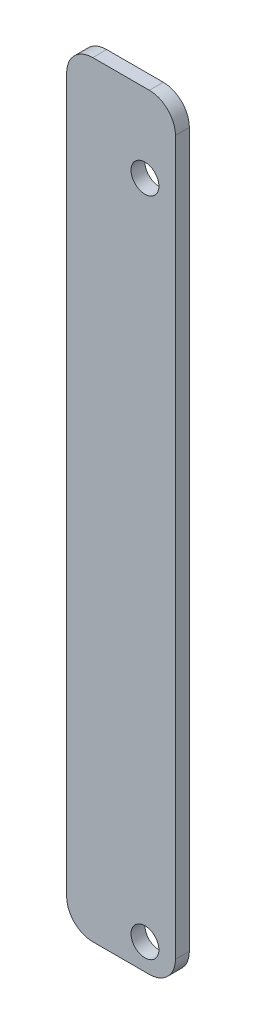
ISO-10303-21;
HEADER;
FILE_DESCRIPTION(('STEP AP214'),'2;1');
FILE_NAME('part.step','',(''),(''),'','','');
FILE_SCHEMA(('AUTOMOTIVE_DESIGN { 1 0 10303 214 1 1 1 1 }'));
ENDSEC;
DATA;
#1=APPLICATION_CONTEXT('core data for automotive mechanical design processes');
#2=APPLICATION_PROTOCOL_DEFINITION('international standard','automotive_design',2000,#1);
#3=PRODUCT_CONTEXT('',#1,'mechanical');
#4=PRODUCT('Part','Part','',(#3));
#5=PRODUCT_RELATED_PRODUCT_CATEGORY('part','',(#4));
#6=PRODUCT_DEFINITION_FORMATION('','',#4);
#7=PRODUCT_DEFINITION_CONTEXT('part definition',#1,'design');
#8=PRODUCT_DEFINITION('design','',#6,#7);
#9=PRODUCT_DEFINITION_SHAPE('','',#8);
#10=(LENGTH_UNIT() NAMED_UNIT(*) SI_UNIT(.MILLI.,.METRE.));
#11=(NAMED_UNIT(*) PLANE_ANGLE_UNIT() SI_UNIT($,.RADIAN.));
#12=(NAMED_UNIT(*) SI_UNIT($,.STERADIAN.) SOLID_ANGLE_UNIT());
#13=UNCERTAINTY_MEASURE_WITH_UNIT(LENGTH_MEASURE(1.E-05),#10,'distance_accuracy_value','');
#14=(GEOMETRIC_REPRESENTATION_CONTEXT(3) GLOBAL_UNCERTAINTY_ASSIGNED_CONTEXT((#13)) GLOBAL_UNIT_ASSIGNED_CONTEXT((#10,
#11,#12)) REPRESENTATION_CONTEXT('',''));
#15=CARTESIAN_POINT('',(0.,0.,0.));
#16=DIRECTION('',(0.,0.,1.));
#17=DIRECTION('',(1.,0.,0.));
#18=AXIS2_PLACEMENT_3D('',#15,#16,#17);
#19=CARTESIAN_POINT('',(-46.8525204271578,-49.9812204173606,98.4383468434213));
#20=DIRECTION('',(0.,0.,-1.));
#21=DIRECTION('',(-1.,0.,0.));
#22=AXIS2_PLACEMENT_3D('',#19,#20,#21);
#23=PLANE('',#22);
#24=CARTESIAN_POINT('',(-50.3525204271578,29.0187795826394,98.4383468434213));
#25=DIRECTION('',(0.,0.,1.));
#26=DIRECTION('',(1.,0.,0.));
#27=AXIS2_PLACEMENT_3D('',#24,#25,#26);
#28=CIRCLE('',#27,1.59999999999999);
#29=CARTESIAN_POINT('',(-48.7525204271578,29.0187795826394,98.4383468434213));
#30=VERTEX_POINT('',#29);
#31=EDGE_CURVE('E185',#30,#30,#28,.T.);
#32=ORIENTED_EDGE('',*,*,#31,.F.);
#33=EDGE_LOOP('',(#32));
#34=FACE_BOUND('',#33,.T.);
#35=DIRECTION('',(0.,1.,0.));
#36=VECTOR('',#35,1.);
#37=CARTESIAN_POINT('',(-46.8525204271578,38.0187795826394,98.4383468434213));
#38=LINE('',#37,#36);
#39=CARTESIAN_POINT('',(-46.8525204271578,-46.9812204173606,98.4383468434213));
#40=VERTEX_POINT('',#39);
#41=CARTESIAN_POINT('',(-46.8525204271578,35.0187795826394,98.4383468434213));
#42=VERTEX_POINT('',#41);
#43=EDGE_CURVE('E134',#40,#42,#38,.T.);
#44=ORIENTED_EDGE('',*,*,#43,.T.);
#45=CARTESIAN_POINT('',(-49.8525204271578,35.0187795826394,98.4383468434213));
#46=DIRECTION('',(0.,0.,-1.));
#47=DIRECTION('',(-1.,0.,0.));
#48=AXIS2_PLACEMENT_3D('',#45,#46,#47);
#49=CIRCLE('',#48,3.);
#50=CARTESIAN_POINT('',(-49.8525204271578,38.0187795826394,98.4383468434213));
#51=VERTEX_POINT('',#50);
#52=EDGE_CURVE('E149',#42,#51,#49,.F.);
#53=ORIENTED_EDGE('',*,*,#52,.T.);
#54=DIRECTION('',(-1.,0.,0.));
#55=VECTOR('',#54,1.);
#56=CARTESIAN_POINT('',(-46.8525204271578,38.0187795826394,98.4383468434213));
#57=LINE('',#56,#55);
#58=CARTESIAN_POINT('',(-56.3525204271578,38.0187795826394,98.4383468434213));
#59=VERTEX_POINT('',#58);
#60=EDGE_CURVE('E117',#51,#59,#57,.T.);
#61=ORIENTED_EDGE('',*,*,#60,.T.);
#62=CARTESIAN_POINT('',(-56.3525204271578,35.0187795826394,98.4383468434213));
#63=DIRECTION('',(0.,0.,-1.));
#64=DIRECTION('',(-1.,0.,0.));
#65=AXIS2_PLACEMENT_3D('',#62,#63,#64);
#66=CIRCLE('',#65,3.);
#67=CARTESIAN_POINT('',(-59.3525204271578,35.0187795826394,98.4383468434213));
#68=VERTEX_POINT('',#67);
#69=EDGE_CURVE('E147',#59,#68,#66,.F.);
#70=ORIENTED_EDGE('',*,*,#69,.T.);
#71=DIRECTION('',(0.,-1.,0.));
#72=VECTOR('',#71,1.);
#73=CARTESIAN_POINT('',(-59.3525204271578,38.0187795826394,98.4383468434213));
#74=LINE('',#73,#72);
#75=CARTESIAN_POINT('',(-59.3525204271578,-46.9812204173606,98.4383468434213));
#76=VERTEX_POINT('',#75);
#77=EDGE_CURVE('E169',#68,#76,#74,.T.);
#78=ORIENTED_EDGE('',*,*,#77,.T.);
#79=CARTESIAN_POINT('',(-56.3525204271578,-46.9812204173606,98.4383468434213));
#80=DIRECTION('',(0.,0.,-1.));
#81=DIRECTION('',(-1.,0.,0.));
#82=AXIS2_PLACEMENT_3D('',#79,#80,#81);
#83=CIRCLE('',#82,3.);
#84=CARTESIAN_POINT('',(-56.3525204271578,-49.9812204173606,98.4383468434213));
#85=VERTEX_POINT('',#84);
#86=EDGE_CURVE('E52',#76,#85,#83,.F.);
#87=ORIENTED_EDGE('',*,*,#86,.T.);
#88=DIRECTION('',(1.,0.,0.));
#89=VECTOR('',#88,1.);
#90=CARTESIAN_POINT('',(-46.8525204271578,-49.9812204173606,98.4383468434213));
#91=LINE('',#90,#89);
#92=CARTESIAN_POINT('',(-49.8525204271578,-49.9812204173606,98.4383468434213));
#93=VERTEX_POINT('',#92);
#94=EDGE_CURVE('E135',#85,#93,#91,.T.);
#95=ORIENTED_EDGE('',*,*,#94,.T.);
#96=CARTESIAN_POINT('',(-49.8525204271578,-46.9812204173606,98.4383468434213));
#97=DIRECTION('',(0.,0.,-1.));
#98=DIRECTION('',(-1.,0.,0.));
#99=AXIS2_PLACEMENT_3D('',#96,#97,#98);
#100=CIRCLE('',#99,3.);
#101=EDGE_CURVE('E145',#93,#40,#100,.F.);
#102=ORIENTED_EDGE('',*,*,#101,.T.);
#103=EDGE_LOOP('',(#44,#53,#61,#70,#78,#87,#95,#102));
#104=FACE_BOUND('',#103,.T.);
#105=CARTESIAN_POINT('',(-50.3525204271578,-46.9812204173606,98.4383468434213));
#106=DIRECTION('',(0.,0.,1.));
#107=DIRECTION('',(1.,0.,0.));
#108=AXIS2_PLACEMENT_3D('',#105,#106,#107);
#109=CIRCLE('',#108,1.59999999999999);
#110=CARTESIAN_POINT('',(-48.7525204271578,-46.9812204173606,98.4383468434213));
#111=VERTEX_POINT('',#110);
#112=EDGE_CURVE('E180',#111,#111,#109,.T.);
#113=ORIENTED_EDGE('',*,*,#112,.F.);
#114=EDGE_LOOP('',(#113));
#115=FACE_BOUND('',#114,.T.);
#116=ADVANCED_FACE('F32',(#34,#104,#115),#23,.F.);
#117=CARTESIAN_POINT('',(-46.8525204271578,38.0187795826394,98.4383468434213));
#118=DIRECTION('',(-1.,0.,0.));
#119=DIRECTION('',(0.,-1.,0.));
#120=AXIS2_PLACEMENT_3D('',#117,#118,#119);
#121=PLANE('',#120);
#122=DIRECTION('',(0.,1.,0.));
#123=VECTOR('',#122,1.);
#124=CARTESIAN_POINT('',(-46.8525204271578,38.0187795826394,96.8383468434213));
#125=LINE('',#124,#123);
#126=CARTESIAN_POINT('',(-46.8525204271578,-46.9812204173606,96.8383468434213));
#127=VERTEX_POINT('',#126);
#128=CARTESIAN_POINT('',(-46.8525204271578,35.0187795826394,96.8383468434213));
#129=VERTEX_POINT('',#128);
#130=EDGE_CURVE('E124',#127,#129,#125,.T.);
#131=ORIENTED_EDGE('',*,*,#130,.T.);
#132=DIRECTION('',(0.,0.,-1.));
#133=VECTOR('',#132,1.);
#134=CARTESIAN_POINT('',(-46.8525204271578,35.0187795826394,98.4383468434213));
#135=LINE('',#134,#133);
#136=EDGE_CURVE('E102',#129,#42,#135,.F.);
#137=ORIENTED_EDGE('',*,*,#136,.T.);
#138=ORIENTED_EDGE('',*,*,#43,.F.);
#139=DIRECTION('',(0.,0.,-1.));
#140=VECTOR('',#139,1.);
#141=CARTESIAN_POINT('',(-46.8525204271578,-46.9812204173606,98.4383468434213));
#142=LINE('',#141,#140);
#143=EDGE_CURVE('E107',#40,#127,#142,.T.);
#144=ORIENTED_EDGE('',*,*,#143,.T.);
#145=EDGE_LOOP('',(#131,#137,#138,#144));
#146=FACE_BOUND('',#145,.T.);
#147=ADVANCED_FACE('F166',(#146),#121,.F.);
#148=CARTESIAN_POINT('',(-46.8525204271578,38.0187795826394,98.4383468434213));
#149=DIRECTION('',(0.,-1.,0.));
#150=DIRECTION('',(0.,0.,-1.));
#151=AXIS2_PLACEMENT_3D('',#148,#149,#150);
#152=PLANE('',#151);
#153=ORIENTED_EDGE('',*,*,#60,.F.);
#154=DIRECTION('',(0.,0.,-1.));
#155=VECTOR('',#154,1.);
#156=CARTESIAN_POINT('',(-49.8525204271578,38.0187795826394,98.4383468434213));
#157=LINE('',#156,#155);
#158=CARTESIAN_POINT('',(-49.8525204271578,38.0187795826394,96.8383468434213));
#159=VERTEX_POINT('',#158);
#160=EDGE_CURVE('E101',#51,#159,#157,.T.);
#161=ORIENTED_EDGE('',*,*,#160,.T.);
#162=DIRECTION('',(-1.,0.,0.));
#163=VECTOR('',#162,1.);
#164=CARTESIAN_POINT('',(-46.8525204271578,38.0187795826394,96.8383468434213));
#165=LINE('',#164,#163);
#166=CARTESIAN_POINT('',(-56.3525204271578,38.0187795826394,96.8383468434213));
#167=VERTEX_POINT('',#166);
#168=EDGE_CURVE('E114',#159,#167,#165,.T.);
#169=ORIENTED_EDGE('',*,*,#168,.T.);
#170=DIRECTION('',(0.,0.,-1.));
#171=VECTOR('',#170,1.);
#172=CARTESIAN_POINT('',(-56.3525204271578,38.0187795826394,98.4383468434213));
#173=LINE('',#172,#171);
#174=EDGE_CURVE('E119',#167,#59,#173,.F.);
#175=ORIENTED_EDGE('',*,*,#174,.T.);
#176=EDGE_LOOP('',(#153,#161,#169,#175));
#177=FACE_BOUND('',#176,.T.);
#178=ADVANCED_FACE('F113',(#177),#152,.F.);
#179=CARTESIAN_POINT('',(-59.3525204271578,38.0187795826394,98.4383468434213));
#180=DIRECTION('',(1.,0.,0.));
#181=DIRECTION('',(0.,1.,0.));
#182=AXIS2_PLACEMENT_3D('',#179,#180,#181);
#183=PLANE('',#182);
#184=ORIENTED_EDGE('',*,*,#77,.F.);
#185=DIRECTION('',(0.,0.,-1.));
#186=VECTOR('',#185,1.);
#187=CARTESIAN_POINT('',(-59.3525204271578,35.0187795826394,98.4383468434213));
#188=LINE('',#187,#186);
#189=CARTESIAN_POINT('',(-59.3525204271578,35.0187795826394,96.8383468434213));
#190=VERTEX_POINT('',#189);
#191=EDGE_CURVE('E153',#68,#190,#188,.T.);
#192=ORIENTED_EDGE('',*,*,#191,.T.);
#193=DIRECTION('',(0.,-1.,0.));
#194=VECTOR('',#193,1.);
#195=CARTESIAN_POINT('',(-59.3525204271578,38.0187795826394,96.8383468434213));
#196=LINE('',#195,#194);
#197=CARTESIAN_POINT('',(-59.3525204271578,-46.9812204173606,96.8383468434213));
#198=VERTEX_POINT('',#197);
#199=EDGE_CURVE('E123',#190,#198,#196,.T.);
#200=ORIENTED_EDGE('',*,*,#199,.T.);
#201=DIRECTION('',(0.,0.,-1.));
#202=VECTOR('',#201,1.);
#203=CARTESIAN_POINT('',(-59.3525204271578,-46.9812204173606,98.4383468434213));
#204=LINE('',#203,#202);
#205=EDGE_CURVE('E151',#198,#76,#204,.F.);
#206=ORIENTED_EDGE('',*,*,#205,.T.);
#207=EDGE_LOOP('',(#184,#192,#200,#206));
#208=FACE_BOUND('',#207,.T.);
#209=ADVANCED_FACE('F211',(#208),#183,.F.);
#210=CARTESIAN_POINT('',(-46.8525204271578,-49.9812204173606,98.4383468434213));
#211=DIRECTION('',(0.,1.,0.));
#212=DIRECTION('',(-1.,0.,0.));
#213=AXIS2_PLACEMENT_3D('',#210,#211,#212);
#214=PLANE('',#213);
#215=DIRECTION('',(1.,0.,0.));
#216=VECTOR('',#215,1.);
#217=CARTESIAN_POINT('',(-46.8525204271578,-49.9812204173606,96.8383468434213));
#218=LINE('',#217,#216);
#219=CARTESIAN_POINT('',(-56.3525204271578,-49.9812204173606,96.8383468434213));
#220=VERTEX_POINT('',#219);
#221=CARTESIAN_POINT('',(-49.8525204271578,-49.9812204173606,96.8383468434213));
#222=VERTEX_POINT('',#221);
#223=EDGE_CURVE('E127',#220,#222,#218,.T.);
#224=ORIENTED_EDGE('',*,*,#223,.T.);
#225=DIRECTION('',(0.,0.,-1.));
#226=VECTOR('',#225,1.);
#227=CARTESIAN_POINT('',(-49.8525204271578,-49.9812204173606,98.4383468434213));
#228=LINE('',#227,#226);
#229=EDGE_CURVE('E11',#222,#93,#228,.F.);
#230=ORIENTED_EDGE('',*,*,#229,.T.);
#231=ORIENTED_EDGE('',*,*,#94,.F.);
#232=DIRECTION('',(0.,0.,-1.));
#233=VECTOR('',#232,1.);
#234=CARTESIAN_POINT('',(-56.3525204271578,-49.9812204173606,98.4383468434213));
#235=LINE('',#234,#233);
#236=EDGE_CURVE('E40',#85,#220,#235,.T.);
#237=ORIENTED_EDGE('',*,*,#236,.T.);
#238=EDGE_LOOP('',(#224,#230,#231,#237));
#239=FACE_BOUND('',#238,.T.);
#240=ADVANCED_FACE('F158',(#239),#214,.F.);
#241=CARTESIAN_POINT('',(-46.8525204271578,-49.9812204173606,96.8383468434213));
#242=DIRECTION('',(0.,0.,-1.));
#243=DIRECTION('',(-1.,0.,0.));
#244=AXIS2_PLACEMENT_3D('',#241,#242,#243);
#245=PLANE('',#244);
#246=CARTESIAN_POINT('',(-50.3525204271578,29.0187795826394,96.8383468434213));
#247=DIRECTION('',(0.,0.,1.));
#248=DIRECTION('',(1.,0.,0.));
#249=AXIS2_PLACEMENT_3D('',#246,#247,#248);
#250=CIRCLE('',#249,1.59999999999999);
#251=CARTESIAN_POINT('',(-48.7525204271578,29.0187795826394,96.8383468434213));
#252=VERTEX_POINT('',#251);
#253=EDGE_CURVE('E182',#252,#252,#250,.T.);
#254=ORIENTED_EDGE('',*,*,#253,.T.);
#255=EDGE_LOOP('',(#254));
#256=FACE_BOUND('',#255,.T.);
#257=CARTESIAN_POINT('',(-50.3525204271578,-46.9812204173606,96.8383468434213));
#258=DIRECTION('',(0.,0.,1.));
#259=DIRECTION('',(1.,0.,0.));
#260=AXIS2_PLACEMENT_3D('',#257,#258,#259);
#261=CIRCLE('',#260,1.59999999999999);
#262=CARTESIAN_POINT('',(-48.7525204271578,-46.9812204173606,96.8383468434213));
#263=VERTEX_POINT('',#262);
#264=EDGE_CURVE('E129',#263,#263,#261,.T.);
#265=ORIENTED_EDGE('',*,*,#264,.T.);
#266=EDGE_LOOP('',(#265));
#267=FACE_BOUND('',#266,.T.);
#268=ORIENTED_EDGE('',*,*,#168,.F.);
#269=CARTESIAN_POINT('',(-49.8525204271578,35.0187795826394,96.8383468434213));
#270=DIRECTION('',(0.,0.,-1.));
#271=DIRECTION('',(-1.,0.,0.));
#272=AXIS2_PLACEMENT_3D('',#269,#270,#271);
#273=CIRCLE('',#272,3.);
#274=EDGE_CURVE('E97',#159,#129,#273,.T.);
#275=ORIENTED_EDGE('',*,*,#274,.T.);
#276=ORIENTED_EDGE('',*,*,#130,.F.);
#277=CARTESIAN_POINT('',(-49.8525204271578,-46.9812204173606,96.8383468434213));
#278=DIRECTION('',(0.,0.,-1.));
#279=DIRECTION('',(-1.,0.,0.));
#280=AXIS2_PLACEMENT_3D('',#277,#278,#279);
#281=CIRCLE('',#280,3.);
#282=EDGE_CURVE('E138',#127,#222,#281,.T.);
#283=ORIENTED_EDGE('',*,*,#282,.T.);
#284=ORIENTED_EDGE('',*,*,#223,.F.);
#285=CARTESIAN_POINT('',(-56.3525204271578,-46.9812204173606,96.8383468434213));
#286=DIRECTION('',(0.,0.,-1.));
#287=DIRECTION('',(-1.,0.,0.));
#288=AXIS2_PLACEMENT_3D('',#285,#286,#287);
#289=CIRCLE('',#288,3.);
#290=EDGE_CURVE('E118',#220,#198,#289,.T.);
#291=ORIENTED_EDGE('',*,*,#290,.T.);
#292=ORIENTED_EDGE('',*,*,#199,.F.);
#293=CARTESIAN_POINT('',(-56.3525204271578,35.0187795826394,96.8383468434213));
#294=DIRECTION('',(0.,0.,-1.));
#295=DIRECTION('',(-1.,0.,0.));
#296=AXIS2_PLACEMENT_3D('',#293,#294,#295);
#297=CIRCLE('',#296,3.);
#298=EDGE_CURVE('E108',#190,#167,#297,.T.);
#299=ORIENTED_EDGE('',*,*,#298,.T.);
#300=EDGE_LOOP('',(#268,#275,#276,#283,#284,#291,#292,#299));
#301=FACE_BOUND('',#300,.T.);
#302=ADVANCED_FACE('F121',(#256,#267,#301),#245,.T.);
#303=CARTESIAN_POINT('',(-50.3525204271578,-46.9812204173606,98.4383468434213));
#304=DIRECTION('',(0.,0.,1.));
#305=DIRECTION('',(1.,0.,0.));
#306=AXIS2_PLACEMENT_3D('',#303,#304,#305);
#307=CYLINDRICAL_SURFACE('',#306,1.59999999999999);
#308=ORIENTED_EDGE('',*,*,#264,.F.);
#309=EDGE_LOOP('',(#308));
#310=FACE_BOUND('',#309,.T.);
#311=ORIENTED_EDGE('',*,*,#112,.T.);
#312=EDGE_LOOP('',(#311));
#313=FACE_BOUND('',#312,.T.);
#314=ADVANCED_FACE('F193',(#310,#313),#307,.F.);
#315=CARTESIAN_POINT('',(-50.3525204271578,29.0187795826394,98.4383468434213));
#316=DIRECTION('',(0.,0.,1.));
#317=DIRECTION('',(1.,0.,0.));
#318=AXIS2_PLACEMENT_3D('',#315,#316,#317);
#319=CYLINDRICAL_SURFACE('',#318,1.59999999999999);
#320=ORIENTED_EDGE('',*,*,#253,.F.);
#321=EDGE_LOOP('',(#320));
#322=FACE_BOUND('',#321,.T.);
#323=ORIENTED_EDGE('',*,*,#31,.T.);
#324=EDGE_LOOP('',(#323));
#325=FACE_BOUND('',#324,.T.);
#326=ADVANCED_FACE('F191',(#322,#325),#319,.F.);
#327=CARTESIAN_POINT('',(-49.8525204271578,35.0187795826394,98.4383468434213));
#328=DIRECTION('',(0.,0.,-1.));
#329=DIRECTION('',(-1.,0.,0.));
#330=AXIS2_PLACEMENT_3D('',#327,#328,#329);
#331=CYLINDRICAL_SURFACE('',#330,3.);
#332=ORIENTED_EDGE('',*,*,#52,.F.);
#333=ORIENTED_EDGE('',*,*,#136,.F.);
#334=ORIENTED_EDGE('',*,*,#274,.F.);
#335=ORIENTED_EDGE('',*,*,#160,.F.);
#336=EDGE_LOOP('',(#332,#333,#334,#335));
#337=FACE_BOUND('',#336,.T.);
#338=ADVANCED_FACE('F100',(#337),#331,.T.);
#339=CARTESIAN_POINT('',(-56.3525204271578,35.0187795826394,98.4383468434213));
#340=DIRECTION('',(0.,0.,-1.));
#341=DIRECTION('',(-1.,0.,0.));
#342=AXIS2_PLACEMENT_3D('',#339,#340,#341);
#343=CYLINDRICAL_SURFACE('',#342,3.);
#344=ORIENTED_EDGE('',*,*,#69,.F.);
#345=ORIENTED_EDGE('',*,*,#174,.F.);
#346=ORIENTED_EDGE('',*,*,#298,.F.);
#347=ORIENTED_EDGE('',*,*,#191,.F.);
#348=EDGE_LOOP('',(#344,#345,#346,#347));
#349=FACE_BOUND('',#348,.T.);
#350=ADVANCED_FACE('F200',(#349),#343,.T.);
#351=CARTESIAN_POINT('',(-49.8525204271578,-46.9812204173606,98.4383468434213));
#352=DIRECTION('',(0.,0.,-1.));
#353=DIRECTION('',(-1.,0.,0.));
#354=AXIS2_PLACEMENT_3D('',#351,#352,#353);
#355=CYLINDRICAL_SURFACE('',#354,3.);
#356=ORIENTED_EDGE('',*,*,#101,.F.);
#357=ORIENTED_EDGE('',*,*,#229,.F.);
#358=ORIENTED_EDGE('',*,*,#282,.F.);
#359=ORIENTED_EDGE('',*,*,#143,.F.);
#360=EDGE_LOOP('',(#356,#357,#358,#359));
#361=FACE_BOUND('',#360,.T.);
#362=ADVANCED_FACE('F163',(#361),#355,.T.);
#363=CARTESIAN_POINT('',(-56.3525204271578,-46.9812204173606,98.4383468434213));
#364=DIRECTION('',(0.,0.,-1.));
#365=DIRECTION('',(-1.,0.,0.));
#366=AXIS2_PLACEMENT_3D('',#363,#364,#365);
#367=CYLINDRICAL_SURFACE('',#366,3.);
#368=ORIENTED_EDGE('',*,*,#86,.F.);
#369=ORIENTED_EDGE('',*,*,#205,.F.);
#370=ORIENTED_EDGE('',*,*,#290,.F.);
#371=ORIENTED_EDGE('',*,*,#236,.F.);
#372=EDGE_LOOP('',(#368,#369,#370,#371));
#373=FACE_BOUND('',#372,.T.);
#374=ADVANCED_FACE('F34',(#373),#367,.T.);
#375=CLOSED_SHELL('',(#116,#147,#178,#209,#240,#302,#314,#326,#338,#350,#362,#374));
#376=MANIFOLD_SOLID_BREP('B2',#375);
#377=ADVANCED_BREP_SHAPE_REPRESENTATION('',(#18,#376),#14);
#378=SHAPE_DEFINITION_REPRESENTATION(#9,#377);
ENDSEC;
END-ISO-10303-21;
